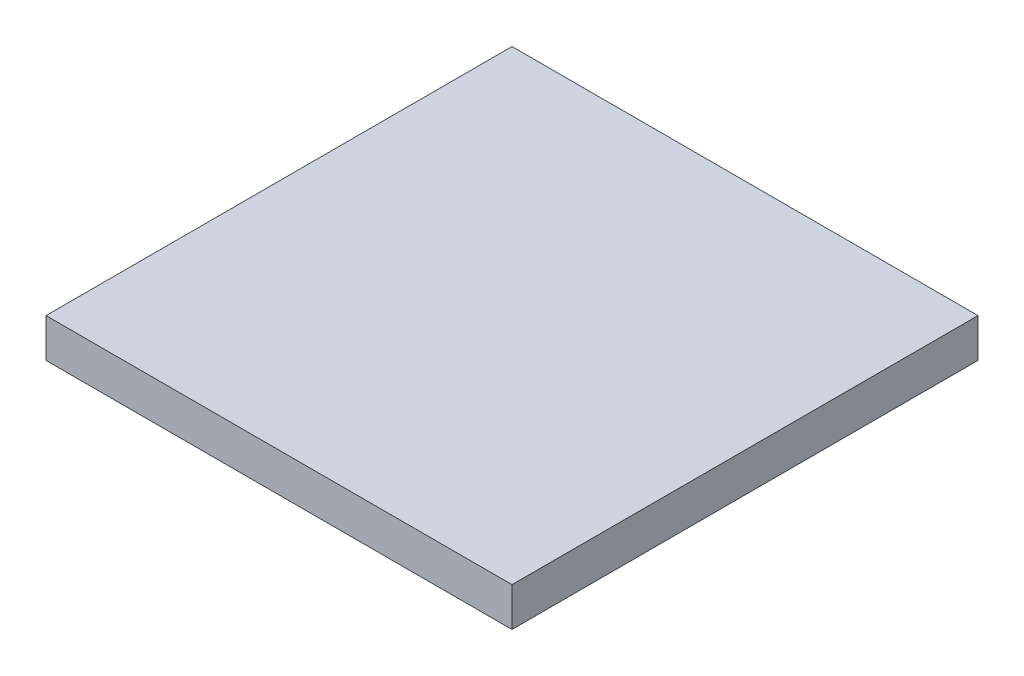
ISO-10303-21;
HEADER;
FILE_DESCRIPTION(('STEP AP214'),'2;1');
FILE_NAME('part.step','',(''),(''),'','','');
FILE_SCHEMA(('AUTOMOTIVE_DESIGN { 1 0 10303 214 1 1 1 1 }'));
ENDSEC;
DATA;
#1=APPLICATION_CONTEXT('core data for automotive mechanical design processes');
#2=APPLICATION_PROTOCOL_DEFINITION('international standard','automotive_design',2000,#1);
#3=PRODUCT_CONTEXT('',#1,'mechanical');
#4=PRODUCT('Part','Part','',(#3));
#5=PRODUCT_RELATED_PRODUCT_CATEGORY('part','',(#4));
#6=PRODUCT_DEFINITION_FORMATION('','',#4);
#7=PRODUCT_DEFINITION_CONTEXT('part definition',#1,'design');
#8=PRODUCT_DEFINITION('design','',#6,#7);
#9=PRODUCT_DEFINITION_SHAPE('','',#8);
#10=(LENGTH_UNIT() NAMED_UNIT(*) SI_UNIT(.MILLI.,.METRE.));
#11=(NAMED_UNIT(*) PLANE_ANGLE_UNIT() SI_UNIT($,.RADIAN.));
#12=(NAMED_UNIT(*) SI_UNIT($,.STERADIAN.) SOLID_ANGLE_UNIT());
#13=UNCERTAINTY_MEASURE_WITH_UNIT(LENGTH_MEASURE(1.E-05),#10,'distance_accuracy_value','');
#14=(GEOMETRIC_REPRESENTATION_CONTEXT(3) GLOBAL_UNCERTAINTY_ASSIGNED_CONTEXT((#13)) GLOBAL_UNIT_ASSIGNED_CONTEXT((#10,
#11,#12)) REPRESENTATION_CONTEXT('',''));
#15=CARTESIAN_POINT('',(0.,0.,0.));
#16=DIRECTION('',(0.,0.,1.));
#17=DIRECTION('',(1.,0.,0.));
#18=AXIS2_PLACEMENT_3D('',#15,#16,#17);
#19=CARTESIAN_POINT('',(-30.,5.,30.));
#20=DIRECTION('',(0.,0.,-1.));
#21=DIRECTION('',(-1.,0.,0.));
#22=AXIS2_PLACEMENT_3D('',#19,#20,#21);
#23=PLANE('',#22);
#24=DIRECTION('',(1.,0.,0.));
#25=VECTOR('',#24,1.);
#26=CARTESIAN_POINT('',(-30.,0.,30.));
#27=LINE('',#26,#25);
#28=CARTESIAN_POINT('',(-30.,0.,30.));
#29=VERTEX_POINT('',#28);
#30=CARTESIAN_POINT('',(30.,0.,30.));
#31=VERTEX_POINT('',#30);
#32=EDGE_CURVE('E99',#29,#31,#27,.T.);
#33=ORIENTED_EDGE('',*,*,#32,.T.);
#34=DIRECTION('',(0.,-1.,0.));
#35=VECTOR('',#34,1.);
#36=CARTESIAN_POINT('',(30.,5.,30.));
#37=LINE('',#36,#35);
#38=CARTESIAN_POINT('',(30.,5.,30.));
#39=VERTEX_POINT('',#38);
#40=EDGE_CURVE('E11',#39,#31,#37,.T.);
#41=ORIENTED_EDGE('',*,*,#40,.F.);
#42=DIRECTION('',(1.,0.,0.));
#43=VECTOR('',#42,1.);
#44=CARTESIAN_POINT('',(-30.,5.,30.));
#45=LINE('',#44,#43);
#46=CARTESIAN_POINT('',(-30.,5.,30.));
#47=VERTEX_POINT('',#46);
#48=EDGE_CURVE('E85',#47,#39,#45,.T.);
#49=ORIENTED_EDGE('',*,*,#48,.F.);
#50=DIRECTION('',(0.,-1.,0.));
#51=VECTOR('',#50,1.);
#52=CARTESIAN_POINT('',(-30.,5.,30.));
#53=LINE('',#52,#51);
#54=EDGE_CURVE('E52',#47,#29,#53,.T.);
#55=ORIENTED_EDGE('',*,*,#54,.T.);
#56=EDGE_LOOP('',(#33,#41,#49,#55));
#57=FACE_BOUND('',#56,.T.);
#58=ADVANCED_FACE('F36',(#57),#23,.F.);
#59=CARTESIAN_POINT('',(30.,5.,30.));
#60=DIRECTION('',(-1.,0.,0.));
#61=DIRECTION('',(0.,0.,1.));
#62=AXIS2_PLACEMENT_3D('',#59,#60,#61);
#63=PLANE('',#62);
#64=DIRECTION('',(0.,0.,-1.));
#65=VECTOR('',#64,1.);
#66=CARTESIAN_POINT('',(30.,0.,30.));
#67=LINE('',#66,#65);
#68=CARTESIAN_POINT('',(30.,0.,-30.));
#69=VERTEX_POINT('',#68);
#70=EDGE_CURVE('E90',#31,#69,#67,.T.);
#71=ORIENTED_EDGE('',*,*,#70,.T.);
#72=DIRECTION('',(0.,-1.,0.));
#73=VECTOR('',#72,1.);
#74=CARTESIAN_POINT('',(30.,5.,-30.));
#75=LINE('',#74,#73);
#76=CARTESIAN_POINT('',(30.,5.,-30.));
#77=VERTEX_POINT('',#76);
#78=EDGE_CURVE('E44',#77,#69,#75,.T.);
#79=ORIENTED_EDGE('',*,*,#78,.F.);
#80=DIRECTION('',(0.,0.,-1.));
#81=VECTOR('',#80,1.);
#82=CARTESIAN_POINT('',(30.,5.,30.));
#83=LINE('',#82,#81);
#84=EDGE_CURVE('E77',#39,#77,#83,.T.);
#85=ORIENTED_EDGE('',*,*,#84,.F.);
#86=ORIENTED_EDGE('',*,*,#40,.T.);
#87=EDGE_LOOP('',(#71,#79,#85,#86));
#88=FACE_BOUND('',#87,.T.);
#89=ADVANCED_FACE('F89',(#88),#63,.F.);
#90=CARTESIAN_POINT('',(-30.,5.,-30.));
#91=DIRECTION('',(0.,0.,-1.));
#92=DIRECTION('',(-1.,0.,0.));
#93=AXIS2_PLACEMENT_3D('',#90,#91,#92);
#94=PLANE('',#93);
#95=DIRECTION('',(1.,0.,0.));
#96=VECTOR('',#95,1.);
#97=CARTESIAN_POINT('',(-30.,0.,-30.));
#98=LINE('',#97,#96);
#99=CARTESIAN_POINT('',(-30.,0.,-30.));
#100=VERTEX_POINT('',#99);
#101=EDGE_CURVE('E102',#100,#69,#98,.T.);
#102=ORIENTED_EDGE('',*,*,#101,.F.);
#103=DIRECTION('',(0.,-1.,0.));
#104=VECTOR('',#103,1.);
#105=CARTESIAN_POINT('',(-30.,5.,-30.));
#106=LINE('',#105,#104);
#107=CARTESIAN_POINT('',(-30.,5.,-30.));
#108=VERTEX_POINT('',#107);
#109=EDGE_CURVE('E66',#108,#100,#106,.T.);
#110=ORIENTED_EDGE('',*,*,#109,.F.);
#111=DIRECTION('',(1.,0.,0.));
#112=VECTOR('',#111,1.);
#113=CARTESIAN_POINT('',(-30.,5.,-30.));
#114=LINE('',#113,#112);
#115=EDGE_CURVE('E84',#108,#77,#114,.T.);
#116=ORIENTED_EDGE('',*,*,#115,.T.);
#117=ORIENTED_EDGE('',*,*,#78,.T.);
#118=EDGE_LOOP('',(#102,#110,#116,#117));
#119=FACE_BOUND('',#118,.T.);
#120=ADVANCED_FACE('F93',(#119),#94,.T.);
#121=CARTESIAN_POINT('',(-30.,5.,30.));
#122=DIRECTION('',(-1.,0.,0.));
#123=DIRECTION('',(0.,0.,1.));
#124=AXIS2_PLACEMENT_3D('',#121,#122,#123);
#125=PLANE('',#124);
#126=DIRECTION('',(0.,0.,-1.));
#127=VECTOR('',#126,1.);
#128=CARTESIAN_POINT('',(-30.,0.,30.));
#129=LINE('',#128,#127);
#130=EDGE_CURVE('E104',#29,#100,#129,.T.);
#131=ORIENTED_EDGE('',*,*,#130,.F.);
#132=ORIENTED_EDGE('',*,*,#54,.F.);
#133=DIRECTION('',(0.,0.,-1.));
#134=VECTOR('',#133,1.);
#135=CARTESIAN_POINT('',(-30.,5.,30.));
#136=LINE('',#135,#134);
#137=EDGE_CURVE('E94',#47,#108,#136,.T.);
#138=ORIENTED_EDGE('',*,*,#137,.T.);
#139=ORIENTED_EDGE('',*,*,#109,.T.);
#140=EDGE_LOOP('',(#131,#132,#138,#139));
#141=FACE_BOUND('',#140,.T.);
#142=ADVANCED_FACE('F110',(#141),#125,.T.);
#143=CARTESIAN_POINT('',(0.,5.,0.));
#144=DIRECTION('',(0.,1.,0.));
#145=DIRECTION('',(0.,0.,1.));
#146=AXIS2_PLACEMENT_3D('',#143,#144,#145);
#147=PLANE('',#146);
#148=ORIENTED_EDGE('',*,*,#48,.T.);
#149=ORIENTED_EDGE('',*,*,#84,.T.);
#150=ORIENTED_EDGE('',*,*,#115,.F.);
#151=ORIENTED_EDGE('',*,*,#137,.F.);
#152=EDGE_LOOP('',(#148,#149,#150,#151));
#153=FACE_BOUND('',#152,.T.);
#154=ADVANCED_FACE('F81',(#153),#147,.T.);
#155=CARTESIAN_POINT('',(0.,0.,0.));
#156=DIRECTION('',(0.,1.,0.));
#157=DIRECTION('',(0.,0.,1.));
#158=AXIS2_PLACEMENT_3D('',#155,#156,#157);
#159=PLANE('',#158);
#160=ORIENTED_EDGE('',*,*,#32,.F.);
#161=ORIENTED_EDGE('',*,*,#130,.T.);
#162=ORIENTED_EDGE('',*,*,#101,.T.);
#163=ORIENTED_EDGE('',*,*,#70,.F.);
#164=EDGE_LOOP('',(#160,#161,#162,#163));
#165=FACE_BOUND('',#164,.T.);
#166=ADVANCED_FACE('F109',(#165),#159,.F.);
#167=CLOSED_SHELL('',(#58,#89,#120,#142,#154,#166));
#168=MANIFOLD_SOLID_BREP('B2',#167);
#169=ADVANCED_BREP_SHAPE_REPRESENTATION('',(#18,#168),#14);
#170=SHAPE_DEFINITION_REPRESENTATION(#9,#169);
ENDSEC;
END-ISO-10303-21;
